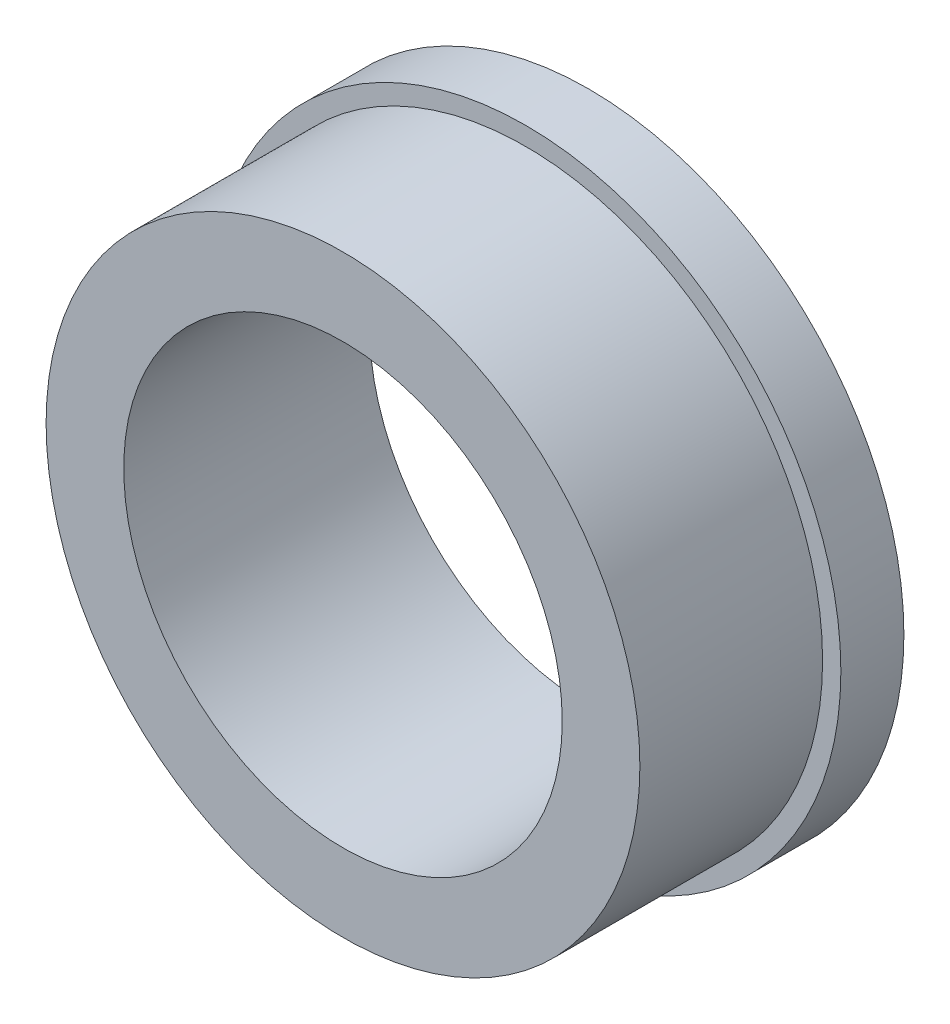
ISO-10303-21;
HEADER;
FILE_DESCRIPTION(('STEP AP214'),'2;1');
FILE_NAME('part.step','',(''),(''),'','','');
FILE_SCHEMA(('AUTOMOTIVE_DESIGN { 1 0 10303 214 1 1 1 1 }'));
ENDSEC;
DATA;
#1=APPLICATION_CONTEXT('core data for automotive mechanical design processes');
#2=APPLICATION_PROTOCOL_DEFINITION('international standard','automotive_design',2000,#1);
#3=PRODUCT_CONTEXT('',#1,'mechanical');
#4=PRODUCT('Part','Part','',(#3));
#5=PRODUCT_RELATED_PRODUCT_CATEGORY('part','',(#4));
#6=PRODUCT_DEFINITION_FORMATION('','',#4);
#7=PRODUCT_DEFINITION_CONTEXT('part definition',#1,'design');
#8=PRODUCT_DEFINITION('design','',#6,#7);
#9=PRODUCT_DEFINITION_SHAPE('','',#8);
#10=(LENGTH_UNIT() NAMED_UNIT(*) SI_UNIT(.MILLI.,.METRE.));
#11=(NAMED_UNIT(*) PLANE_ANGLE_UNIT() SI_UNIT($,.RADIAN.));
#12=(NAMED_UNIT(*) SI_UNIT($,.STERADIAN.) SOLID_ANGLE_UNIT());
#13=UNCERTAINTY_MEASURE_WITH_UNIT(LENGTH_MEASURE(1.E-05),#10,'distance_accuracy_value','');
#14=(GEOMETRIC_REPRESENTATION_CONTEXT(3) GLOBAL_UNCERTAINTY_ASSIGNED_CONTEXT((#13)) GLOBAL_UNIT_ASSIGNED_CONTEXT((#10,
#11,#12)) REPRESENTATION_CONTEXT('',''));
#15=CARTESIAN_POINT('',(0.,0.,0.));
#16=DIRECTION('',(0.,0.,1.));
#17=DIRECTION('',(1.,0.,0.));
#18=AXIS2_PLACEMENT_3D('',#15,#16,#17);
#19=CARTESIAN_POINT('',(0.,0.,5.38));
#20=DIRECTION('',(0.,0.,-1.));
#21=DIRECTION('',(-1.,0.,0.));
#22=AXIS2_PLACEMENT_3D('',#19,#20,#21);
#23=CYLINDRICAL_SURFACE('',#22,6.9);
#24=CARTESIAN_POINT('',(0.,0.,0.));
#25=DIRECTION('',(0.,0.,1.));
#26=DIRECTION('',(1.,0.,0.));
#27=AXIS2_PLACEMENT_3D('',#24,#25,#26);
#28=CIRCLE('',#27,6.9);
#29=CARTESIAN_POINT('',(6.9,0.,0.));
#30=VERTEX_POINT('',#29);
#31=EDGE_CURVE('E11',#30,#30,#28,.T.);
#32=ORIENTED_EDGE('',*,*,#31,.T.);
#33=EDGE_LOOP('',(#32));
#34=FACE_BOUND('',#33,.T.);
#35=CARTESIAN_POINT('',(0.,0.,1.38));
#36=DIRECTION('',(0.,0.,1.));
#37=DIRECTION('',(1.,0.,0.));
#38=AXIS2_PLACEMENT_3D('',#35,#36,#37);
#39=CIRCLE('',#38,6.9);
#40=CARTESIAN_POINT('',(6.9,0.,1.38));
#41=VERTEX_POINT('',#40);
#42=EDGE_CURVE('E41',#41,#41,#39,.T.);
#43=ORIENTED_EDGE('',*,*,#42,.F.);
#44=EDGE_LOOP('',(#43));
#45=FACE_BOUND('',#44,.T.);
#46=ADVANCED_FACE('F38',(#34,#45),#23,.T.);
#47=CARTESIAN_POINT('',(0.,0.,0.));
#48=DIRECTION('',(0.,0.,1.));
#49=DIRECTION('',(1.,0.,0.));
#50=AXIS2_PLACEMENT_3D('',#47,#48,#49);
#51=PLANE('',#50);
#52=CARTESIAN_POINT('',(0.,0.,0.));
#53=DIRECTION('',(0.,0.,1.));
#54=DIRECTION('',(1.,0.,0.));
#55=AXIS2_PLACEMENT_3D('',#52,#53,#54);
#56=CIRCLE('',#55,4.8);
#57=CARTESIAN_POINT('',(4.8,0.,0.));
#58=VERTEX_POINT('',#57);
#59=EDGE_CURVE('E56',#58,#58,#56,.F.);
#60=ORIENTED_EDGE('',*,*,#59,.F.);
#61=EDGE_LOOP('',(#60));
#62=FACE_BOUND('',#61,.T.);
#63=ORIENTED_EDGE('',*,*,#31,.F.);
#64=EDGE_LOOP('',(#63));
#65=FACE_BOUND('',#64,.T.);
#66=ADVANCED_FACE('F85',(#62,#65),#51,.F.);
#67=CARTESIAN_POINT('',(0.,0.,1.38));
#68=DIRECTION('',(0.,0.,1.));
#69=DIRECTION('',(1.,0.,0.));
#70=AXIS2_PLACEMENT_3D('',#67,#68,#69);
#71=PLANE('',#70);
#72=CARTESIAN_POINT('',(0.,0.,1.38));
#73=DIRECTION('',(0.,0.,1.));
#74=DIRECTION('',(1.,0.,0.));
#75=AXIS2_PLACEMENT_3D('',#72,#73,#74);
#76=CIRCLE('',#75,6.5);
#77=CARTESIAN_POINT('',(6.5,0.,1.38));
#78=VERTEX_POINT('',#77);
#79=EDGE_CURVE('E50',#78,#78,#76,.T.);
#80=ORIENTED_EDGE('',*,*,#79,.F.);
#81=EDGE_LOOP('',(#80));
#82=FACE_BOUND('',#81,.T.);
#83=ORIENTED_EDGE('',*,*,#42,.T.);
#84=EDGE_LOOP('',(#83));
#85=FACE_BOUND('',#84,.T.);
#86=ADVANCED_FACE('F79',(#82,#85),#71,.T.);
#87=CARTESIAN_POINT('',(0.,0.,1.38));
#88=DIRECTION('',(0.,0.,1.));
#89=DIRECTION('',(1.,0.,0.));
#90=AXIS2_PLACEMENT_3D('',#87,#88,#89);
#91=CYLINDRICAL_SURFACE('',#90,6.5);
#92=ORIENTED_EDGE('',*,*,#79,.T.);
#93=EDGE_LOOP('',(#92));
#94=FACE_BOUND('',#93,.T.);
#95=CARTESIAN_POINT('',(0.,0.,5.38));
#96=DIRECTION('',(0.,0.,1.));
#97=DIRECTION('',(1.,0.,0.));
#98=AXIS2_PLACEMENT_3D('',#95,#96,#97);
#99=CIRCLE('',#98,6.5);
#100=CARTESIAN_POINT('',(6.5,0.,5.38));
#101=VERTEX_POINT('',#100);
#102=EDGE_CURVE('E52',#101,#101,#99,.T.);
#103=ORIENTED_EDGE('',*,*,#102,.F.);
#104=EDGE_LOOP('',(#103));
#105=FACE_BOUND('',#104,.T.);
#106=ADVANCED_FACE('F74',(#94,#105),#91,.T.);
#107=CARTESIAN_POINT('',(0.,0.,5.38));
#108=DIRECTION('',(0.,0.,1.));
#109=DIRECTION('',(1.,0.,0.));
#110=AXIS2_PLACEMENT_3D('',#107,#108,#109);
#111=PLANE('',#110);
#112=CARTESIAN_POINT('',(0.,0.,5.38));
#113=DIRECTION('',(0.,0.,1.));
#114=DIRECTION('',(1.,0.,0.));
#115=AXIS2_PLACEMENT_3D('',#112,#113,#114);
#116=CIRCLE('',#115,4.8);
#117=CARTESIAN_POINT('',(4.8,0.,5.38));
#118=VERTEX_POINT('',#117);
#119=EDGE_CURVE('E63',#118,#118,#116,.T.);
#120=ORIENTED_EDGE('',*,*,#119,.F.);
#121=EDGE_LOOP('',(#120));
#122=FACE_BOUND('',#121,.T.);
#123=ORIENTED_EDGE('',*,*,#102,.T.);
#124=EDGE_LOOP('',(#123));
#125=FACE_BOUND('',#124,.T.);
#126=ADVANCED_FACE('F71',(#122,#125),#111,.T.);
#127=CARTESIAN_POINT('',(0.,0.,-0.00100000000000013));
#128=DIRECTION('',(0.,0.,1.));
#129=DIRECTION('',(1.,0.,0.));
#130=AXIS2_PLACEMENT_3D('',#127,#128,#129);
#131=CYLINDRICAL_SURFACE('',#130,4.8);
#132=ORIENTED_EDGE('',*,*,#119,.T.);
#133=EDGE_LOOP('',(#132));
#134=FACE_BOUND('',#133,.T.);
#135=ORIENTED_EDGE('',*,*,#59,.T.);
#136=EDGE_LOOP('',(#135));
#137=FACE_BOUND('',#136,.T.);
#138=ADVANCED_FACE('F68',(#134,#137),#131,.F.);
#139=CLOSED_SHELL('',(#46,#66,#86,#106,#126,#138));
#140=MANIFOLD_SOLID_BREP('B2',#139);
#141=ADVANCED_BREP_SHAPE_REPRESENTATION('',(#18,#140),#14);
#142=SHAPE_DEFINITION_REPRESENTATION(#9,#141);
ENDSEC;
END-ISO-10303-21;
